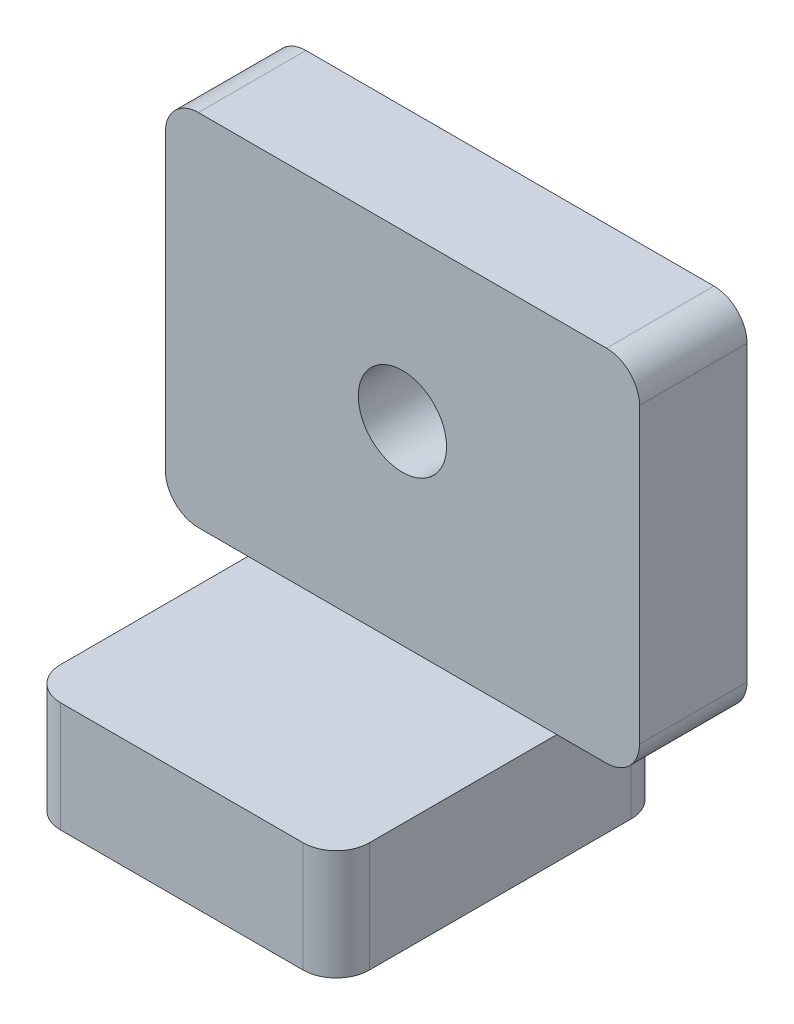
ISO-10303-21;
HEADER;
FILE_DESCRIPTION(('STEP AP214'),'2;1');
FILE_NAME('part.step','',(''),(''),'','','');
FILE_SCHEMA(('AUTOMOTIVE_DESIGN { 1 0 10303 214 1 1 1 1 }'));
ENDSEC;
DATA;
#1=APPLICATION_CONTEXT('core data for automotive mechanical design processes');
#2=APPLICATION_PROTOCOL_DEFINITION('international standard','automotive_design',2000,#1);
#3=PRODUCT_CONTEXT('',#1,'mechanical');
#4=PRODUCT('Part','Part','',(#3));
#5=PRODUCT_RELATED_PRODUCT_CATEGORY('part','',(#4));
#6=PRODUCT_DEFINITION_FORMATION('','',#4);
#7=PRODUCT_DEFINITION_CONTEXT('part definition',#1,'design');
#8=PRODUCT_DEFINITION('design','',#6,#7);
#9=PRODUCT_DEFINITION_SHAPE('','',#8);
#10=(LENGTH_UNIT() NAMED_UNIT(*) SI_UNIT(.MILLI.,.METRE.));
#11=(NAMED_UNIT(*) PLANE_ANGLE_UNIT() SI_UNIT($,.RADIAN.));
#12=(NAMED_UNIT(*) SI_UNIT($,.STERADIAN.) SOLID_ANGLE_UNIT());
#13=UNCERTAINTY_MEASURE_WITH_UNIT(LENGTH_MEASURE(1.E-05),#10,'distance_accuracy_value','');
#14=(GEOMETRIC_REPRESENTATION_CONTEXT(3) GLOBAL_UNCERTAINTY_ASSIGNED_CONTEXT((#13)) GLOBAL_UNIT_ASSIGNED_CONTEXT((#10,
#11,#12)) REPRESENTATION_CONTEXT('',''));
#15=CARTESIAN_POINT('',(0.,0.,0.));
#16=DIRECTION('',(0.,0.,1.));
#17=DIRECTION('',(1.,0.,0.));
#18=AXIS2_PLACEMENT_3D('',#15,#16,#17);
#19=CARTESIAN_POINT('',(-21.5,-16.3,4.875));
#20=DIRECTION('',(0.,1.,0.));
#21=DIRECTION('',(0.,0.,1.));
#22=AXIS2_PLACEMENT_3D('',#19,#20,#21);
#23=PLANE('',#22);
#24=DIRECTION('',(1.,0.,0.));
#25=VECTOR('',#24,1.);
#26=CARTESIAN_POINT('',(-21.5,-16.3,4.875));
#27=LINE('',#26,#25);
#28=CARTESIAN_POINT('',(-18.5,-16.3,4.875));
#29=VERTEX_POINT('',#28);
#30=CARTESIAN_POINT('',(-14.,-16.3,4.875));
#31=VERTEX_POINT('',#30);
#32=EDGE_CURVE('E156',#29,#31,#27,.T.);
#33=ORIENTED_EDGE('',*,*,#32,.F.);
#34=DIRECTION('',(0.,0.,-1.));
#35=VECTOR('',#34,1.);
#36=CARTESIAN_POINT('',(-18.5,-16.3,4.875));
#37=LINE('',#36,#35);
#38=CARTESIAN_POINT('',(-18.5,-16.3,-4.875));
#39=VERTEX_POINT('',#38);
#40=EDGE_CURVE('E262',#29,#39,#37,.T.);
#41=ORIENTED_EDGE('',*,*,#40,.T.);
#42=DIRECTION('',(1.,0.,0.));
#43=VECTOR('',#42,1.);
#44=CARTESIAN_POINT('',(-21.5,-16.3,-4.875));
#45=LINE('',#44,#43);
#46=CARTESIAN_POINT('',(-11.,-16.3,-4.875));
#47=VERTEX_POINT('',#46);
#48=EDGE_CURVE('E206',#39,#47,#45,.T.);
#49=ORIENTED_EDGE('',*,*,#48,.T.);
#50=CARTESIAN_POINT('',(-11.,-16.3,-1.875));
#51=DIRECTION('',(0.,1.,0.));
#52=DIRECTION('',(0.,0.,1.));
#53=AXIS2_PLACEMENT_3D('',#50,#51,#52);
#54=CIRCLE('',#53,3.);
#55=CARTESIAN_POINT('',(-14.,-16.3,-1.875));
#56=VERTEX_POINT('',#55);
#57=EDGE_CURVE('E45',#47,#56,#54,.T.);
#58=ORIENTED_EDGE('',*,*,#57,.T.);
#59=DIRECTION('',(0.,0.,-1.));
#60=VECTOR('',#59,1.);
#61=CARTESIAN_POINT('',(-14.,-16.3,24.875));
#62=LINE('',#61,#60);
#63=EDGE_CURVE('E167',#31,#56,#62,.T.);
#64=ORIENTED_EDGE('',*,*,#63,.F.);
#65=EDGE_LOOP('',(#33,#41,#49,#58,#64));
#66=FACE_BOUND('',#65,.T.);
#67=ADVANCED_FACE('F37',(#66),#23,.F.);
#68=CARTESIAN_POINT('',(21.5,-16.3,4.875));
#69=DIRECTION('',(-1.,0.,0.));
#70=DIRECTION('',(0.,0.,1.));
#71=AXIS2_PLACEMENT_3D('',#68,#69,#70);
#72=PLANE('',#71);
#73=DIRECTION('',(0.,1.,0.));
#74=VECTOR('',#73,1.);
#75=CARTESIAN_POINT('',(21.5,-16.3,4.875));
#76=LINE('',#75,#74);
#77=CARTESIAN_POINT('',(21.5,-13.3,4.875));
#78=VERTEX_POINT('',#77);
#79=CARTESIAN_POINT('',(21.5,13.3,4.875));
#80=VERTEX_POINT('',#79);
#81=EDGE_CURVE('E208',#78,#80,#76,.T.);
#82=ORIENTED_EDGE('',*,*,#81,.F.);
#83=DIRECTION('',(0.,0.,-1.));
#84=VECTOR('',#83,1.);
#85=CARTESIAN_POINT('',(21.5,-13.3,4.875));
#86=LINE('',#85,#84);
#87=CARTESIAN_POINT('',(21.5,-13.3,-4.875));
#88=VERTEX_POINT('',#87);
#89=EDGE_CURVE('E250',#78,#88,#86,.T.);
#90=ORIENTED_EDGE('',*,*,#89,.T.);
#91=DIRECTION('',(0.,1.,0.));
#92=VECTOR('',#91,1.);
#93=CARTESIAN_POINT('',(21.5,-16.3,-4.875));
#94=LINE('',#93,#92);
#95=CARTESIAN_POINT('',(21.5,13.3,-4.875));
#96=VERTEX_POINT('',#95);
#97=EDGE_CURVE('E196',#88,#96,#94,.T.);
#98=ORIENTED_EDGE('',*,*,#97,.T.);
#99=DIRECTION('',(0.,0.,-1.));
#100=VECTOR('',#99,1.);
#101=CARTESIAN_POINT('',(21.5,13.3,4.875));
#102=LINE('',#101,#100);
#103=EDGE_CURVE('E248',#96,#80,#102,.F.);
#104=ORIENTED_EDGE('',*,*,#103,.T.);
#105=EDGE_LOOP('',(#82,#90,#98,#104));
#106=FACE_BOUND('',#105,.T.);
#107=ADVANCED_FACE('F320',(#106),#72,.F.);
#108=CARTESIAN_POINT('',(-21.5,16.3,4.875));
#109=DIRECTION('',(0.,-1.,0.));
#110=DIRECTION('',(0.,0.,-1.));
#111=AXIS2_PLACEMENT_3D('',#108,#109,#110);
#112=PLANE('',#111);
#113=DIRECTION('',(-1.,0.,0.));
#114=VECTOR('',#113,1.);
#115=CARTESIAN_POINT('',(-21.5,16.3,-4.875));
#116=LINE('',#115,#114);
#117=CARTESIAN_POINT('',(18.5,16.3,-4.875));
#118=VERTEX_POINT('',#117);
#119=CARTESIAN_POINT('',(-18.5,16.3,-4.875));
#120=VERTEX_POINT('',#119);
#121=EDGE_CURVE('E199',#118,#120,#116,.T.);
#122=ORIENTED_EDGE('',*,*,#121,.T.);
#123=DIRECTION('',(0.,0.,-1.));
#124=VECTOR('',#123,1.);
#125=CARTESIAN_POINT('',(-18.5,16.3,4.875));
#126=LINE('',#125,#124);
#127=CARTESIAN_POINT('',(-18.5,16.3,4.875));
#128=VERTEX_POINT('',#127);
#129=EDGE_CURVE('E271',#120,#128,#126,.F.);
#130=ORIENTED_EDGE('',*,*,#129,.T.);
#131=DIRECTION('',(-1.,0.,0.));
#132=VECTOR('',#131,1.);
#133=CARTESIAN_POINT('',(-21.5,16.3,4.875));
#134=LINE('',#133,#132);
#135=CARTESIAN_POINT('',(18.5,16.3,4.875));
#136=VERTEX_POINT('',#135);
#137=EDGE_CURVE('E277',#136,#128,#134,.T.);
#138=ORIENTED_EDGE('',*,*,#137,.F.);
#139=DIRECTION('',(0.,0.,-1.));
#140=VECTOR('',#139,1.);
#141=CARTESIAN_POINT('',(18.5,16.3,4.875));
#142=LINE('',#141,#140);
#143=EDGE_CURVE('E268',#136,#118,#142,.T.);
#144=ORIENTED_EDGE('',*,*,#143,.T.);
#145=EDGE_LOOP('',(#122,#130,#138,#144));
#146=FACE_BOUND('',#145,.T.);
#147=ADVANCED_FACE('F276',(#146),#112,.F.);
#148=CARTESIAN_POINT('',(-21.5,-16.3,4.875));
#149=DIRECTION('',(1.,0.,0.));
#150=DIRECTION('',(0.,0.,-1.));
#151=AXIS2_PLACEMENT_3D('',#148,#149,#150);
#152=PLANE('',#151);
#153=DIRECTION('',(0.,-1.,0.));
#154=VECTOR('',#153,1.);
#155=CARTESIAN_POINT('',(-21.5,-16.3,-4.875));
#156=LINE('',#155,#154);
#157=CARTESIAN_POINT('',(-21.5,13.3,-4.875));
#158=VERTEX_POINT('',#157);
#159=CARTESIAN_POINT('',(-21.5,-13.3,-4.875));
#160=VERTEX_POINT('',#159);
#161=EDGE_CURVE('E203',#158,#160,#156,.T.);
#162=ORIENTED_EDGE('',*,*,#161,.T.);
#163=DIRECTION('',(0.,0.,-1.));
#164=VECTOR('',#163,1.);
#165=CARTESIAN_POINT('',(-21.5,-13.3,4.875));
#166=LINE('',#165,#164);
#167=CARTESIAN_POINT('',(-21.5,-13.3,4.875));
#168=VERTEX_POINT('',#167);
#169=EDGE_CURVE('E60',#160,#168,#166,.F.);
#170=ORIENTED_EDGE('',*,*,#169,.T.);
#171=DIRECTION('',(0.,-1.,0.));
#172=VECTOR('',#171,1.);
#173=CARTESIAN_POINT('',(-21.5,-16.3,4.875));
#174=LINE('',#173,#172);
#175=CARTESIAN_POINT('',(-21.5,13.3,4.875));
#176=VERTEX_POINT('',#175);
#177=EDGE_CURVE('E192',#176,#168,#174,.T.);
#178=ORIENTED_EDGE('',*,*,#177,.F.);
#179=DIRECTION('',(0.,0.,-1.));
#180=VECTOR('',#179,1.);
#181=CARTESIAN_POINT('',(-21.5,13.3,4.875));
#182=LINE('',#181,#180);
#183=EDGE_CURVE('E264',#176,#158,#182,.T.);
#184=ORIENTED_EDGE('',*,*,#183,.T.);
#185=EDGE_LOOP('',(#162,#170,#178,#184));
#186=FACE_BOUND('',#185,.T.);
#187=ADVANCED_FACE('F287',(#186),#152,.F.);
#188=CARTESIAN_POINT('',(11.,-16.3,-4.875));
#189=VERTEX_POINT('',#188);
#190=CARTESIAN_POINT('',(18.5,-16.3,-4.875));
#191=VERTEX_POINT('',#190);
#192=EDGE_CURVE('E205',#189,#191,#45,.T.);
#193=ORIENTED_EDGE('',*,*,#192,.T.);
#194=DIRECTION('',(0.,0.,-1.));
#195=VECTOR('',#194,1.);
#196=CARTESIAN_POINT('',(18.5,-16.3,4.875));
#197=LINE('',#196,#195);
#198=CARTESIAN_POINT('',(18.5,-16.3,4.875));
#199=VERTEX_POINT('',#198);
#200=EDGE_CURVE('E253',#191,#199,#197,.F.);
#201=ORIENTED_EDGE('',*,*,#200,.T.);
#202=CARTESIAN_POINT('',(14.,-16.3,4.875));
#203=VERTEX_POINT('',#202);
#204=EDGE_CURVE('E169',#203,#199,#27,.T.);
#205=ORIENTED_EDGE('',*,*,#204,.F.);
#206=DIRECTION('',(0.,0.,-1.));
#207=VECTOR('',#206,1.);
#208=CARTESIAN_POINT('',(14.,-16.3,24.875));
#209=LINE('',#208,#207);
#210=CARTESIAN_POINT('',(14.,-16.3,-1.875));
#211=VERTEX_POINT('',#210);
#212=EDGE_CURVE('E186',#203,#211,#209,.T.);
#213=ORIENTED_EDGE('',*,*,#212,.T.);
#214=CARTESIAN_POINT('',(11.,-16.3,-1.875));
#215=DIRECTION('',(0.,1.,0.));
#216=DIRECTION('',(0.,0.,1.));
#217=AXIS2_PLACEMENT_3D('',#214,#215,#216);
#218=CIRCLE('',#217,3.);
#219=EDGE_CURVE('E11',#211,#189,#218,.T.);
#220=ORIENTED_EDGE('',*,*,#219,.T.);
#221=EDGE_LOOP('',(#193,#201,#205,#213,#220));
#222=FACE_BOUND('',#221,.T.);
#223=ADVANCED_FACE('F326',(#222),#23,.F.);
#224=CARTESIAN_POINT('',(0.,0.,4.875));
#225=DIRECTION('',(0.,0.,-1.));
#226=DIRECTION('',(-1.,0.,0.));
#227=AXIS2_PLACEMENT_3D('',#224,#225,#226);
#228=PLANE('',#227);
#229=CARTESIAN_POINT('',(0.,1.30000000000001,4.875));
#230=DIRECTION('',(0.,0.,1.));
#231=DIRECTION('',(1.,0.,0.));
#232=AXIS2_PLACEMENT_3D('',#229,#230,#231);
#233=CIRCLE('',#232,4.);
#234=CARTESIAN_POINT('',(4.,1.30000000000001,4.875));
#235=VERTEX_POINT('',#234);
#236=EDGE_CURVE('E182',#235,#235,#233,.T.);
#237=ORIENTED_EDGE('',*,*,#236,.F.);
#238=EDGE_LOOP('',(#237));
#239=FACE_BOUND('',#238,.T.);
#240=ORIENTED_EDGE('',*,*,#204,.T.);
#241=CARTESIAN_POINT('',(18.5,-13.3,4.875));
#242=DIRECTION('',(0.,0.,-1.));
#243=DIRECTION('',(-1.,0.,0.));
#244=AXIS2_PLACEMENT_3D('',#241,#242,#243);
#245=CIRCLE('',#244,3.);
#246=EDGE_CURVE('E260',#199,#78,#245,.F.);
#247=ORIENTED_EDGE('',*,*,#246,.T.);
#248=ORIENTED_EDGE('',*,*,#81,.T.);
#249=CARTESIAN_POINT('',(18.5,13.3,4.875));
#250=DIRECTION('',(0.,0.,-1.));
#251=DIRECTION('',(-1.,0.,0.));
#252=AXIS2_PLACEMENT_3D('',#249,#250,#251);
#253=CIRCLE('',#252,3.);
#254=EDGE_CURVE('E255',#80,#136,#253,.F.);
#255=ORIENTED_EDGE('',*,*,#254,.T.);
#256=ORIENTED_EDGE('',*,*,#137,.T.);
#257=CARTESIAN_POINT('',(-18.5,13.3,4.875));
#258=DIRECTION('',(0.,0.,-1.));
#259=DIRECTION('',(-1.,0.,0.));
#260=AXIS2_PLACEMENT_3D('',#257,#258,#259);
#261=CIRCLE('',#260,3.);
#262=EDGE_CURVE('E257',#128,#176,#261,.F.);
#263=ORIENTED_EDGE('',*,*,#262,.T.);
#264=ORIENTED_EDGE('',*,*,#177,.T.);
#265=CARTESIAN_POINT('',(-18.5,-13.3,4.875));
#266=DIRECTION('',(0.,0.,-1.));
#267=DIRECTION('',(-1.,0.,0.));
#268=AXIS2_PLACEMENT_3D('',#265,#266,#267);
#269=CIRCLE('',#268,3.);
#270=EDGE_CURVE('E52',#168,#29,#269,.F.);
#271=ORIENTED_EDGE('',*,*,#270,.T.);
#272=ORIENTED_EDGE('',*,*,#32,.T.);
#273=EDGE_CURVE('E161',#31,#203,#27,.T.);
#274=ORIENTED_EDGE('',*,*,#273,.T.);
#275=EDGE_LOOP('',(#240,#247,#248,#255,#256,#263,#264,#271,#272,#274));
#276=FACE_BOUND('',#275,.T.);
#277=ADVANCED_FACE('F159',(#239,#276),#228,.F.);
#278=CARTESIAN_POINT('',(0.,0.,-4.875));
#279=DIRECTION('',(0.,0.,-1.));
#280=DIRECTION('',(-1.,0.,0.));
#281=AXIS2_PLACEMENT_3D('',#278,#279,#280);
#282=PLANE('',#281);
#283=CARTESIAN_POINT('',(0.,1.30000000000001,-4.875));
#284=DIRECTION('',(0.,0.,1.));
#285=DIRECTION('',(1.,0.,0.));
#286=AXIS2_PLACEMENT_3D('',#283,#284,#285);
#287=CIRCLE('',#286,4.);
#288=CARTESIAN_POINT('',(4.,1.30000000000001,-4.875));
#289=VERTEX_POINT('',#288);
#290=EDGE_CURVE('E200',#289,#289,#287,.T.);
#291=ORIENTED_EDGE('',*,*,#290,.T.);
#292=EDGE_LOOP('',(#291));
#293=FACE_BOUND('',#292,.T.);
#294=DIRECTION('',(1.,0.,0.));
#295=VECTOR('',#294,1.);
#296=CARTESIAN_POINT('',(-14.,-26.3,-4.875));
#297=LINE('',#296,#295);
#298=CARTESIAN_POINT('',(-11.,-26.3,-4.875));
#299=VERTEX_POINT('',#298);
#300=CARTESIAN_POINT('',(11.,-26.3,-4.875));
#301=VERTEX_POINT('',#300);
#302=EDGE_CURVE('E296',#299,#301,#297,.T.);
#303=ORIENTED_EDGE('',*,*,#302,.F.);
#304=DIRECTION('',(0.,-1.,0.));
#305=VECTOR('',#304,1.);
#306=CARTESIAN_POINT('',(-11.,-16.3,-4.875));
#307=LINE('',#306,#305);
#308=EDGE_CURVE('E230',#299,#47,#307,.F.);
#309=ORIENTED_EDGE('',*,*,#308,.T.);
#310=ORIENTED_EDGE('',*,*,#48,.F.);
#311=CARTESIAN_POINT('',(-18.5,-13.3,-4.875));
#312=DIRECTION('',(0.,0.,-1.));
#313=DIRECTION('',(-1.,0.,0.));
#314=AXIS2_PLACEMENT_3D('',#311,#312,#313);
#315=CIRCLE('',#314,3.);
#316=EDGE_CURVE('E224',#39,#160,#315,.T.);
#317=ORIENTED_EDGE('',*,*,#316,.T.);
#318=ORIENTED_EDGE('',*,*,#161,.F.);
#319=CARTESIAN_POINT('',(-18.5,13.3,-4.875));
#320=DIRECTION('',(0.,0.,-1.));
#321=DIRECTION('',(-1.,0.,0.));
#322=AXIS2_PLACEMENT_3D('',#319,#320,#321);
#323=CIRCLE('',#322,3.);
#324=EDGE_CURVE('E222',#158,#120,#323,.T.);
#325=ORIENTED_EDGE('',*,*,#324,.T.);
#326=ORIENTED_EDGE('',*,*,#121,.F.);
#327=CARTESIAN_POINT('',(18.5,13.3,-4.875));
#328=DIRECTION('',(0.,0.,-1.));
#329=DIRECTION('',(-1.,0.,0.));
#330=AXIS2_PLACEMENT_3D('',#327,#328,#329);
#331=CIRCLE('',#330,3.);
#332=EDGE_CURVE('E220',#118,#96,#331,.T.);
#333=ORIENTED_EDGE('',*,*,#332,.T.);
#334=ORIENTED_EDGE('',*,*,#97,.F.);
#335=CARTESIAN_POINT('',(18.5,-13.3,-4.875));
#336=DIRECTION('',(0.,0.,-1.));
#337=DIRECTION('',(-1.,0.,0.));
#338=AXIS2_PLACEMENT_3D('',#335,#336,#337);
#339=CIRCLE('',#338,3.);
#340=EDGE_CURVE('E226',#88,#191,#339,.T.);
#341=ORIENTED_EDGE('',*,*,#340,.T.);
#342=ORIENTED_EDGE('',*,*,#192,.F.);
#343=DIRECTION('',(0.,1.,0.));
#344=VECTOR('',#343,1.);
#345=CARTESIAN_POINT('',(11.,-26.3,-4.875));
#346=LINE('',#345,#344);
#347=EDGE_CURVE('E228',#189,#301,#346,.F.);
#348=ORIENTED_EDGE('',*,*,#347,.T.);
#349=EDGE_LOOP('',(#303,#309,#310,#317,#318,#325,#326,#333,#334,#341,#342,#348));
#350=FACE_BOUND('',#349,.T.);
#351=ADVANCED_FACE('F290',(#293,#350),#282,.T.);
#352=CARTESIAN_POINT('',(0.,1.30000000000001,-4.875));
#353=DIRECTION('',(0.,0.,1.));
#354=DIRECTION('',(1.,0.,0.));
#355=AXIS2_PLACEMENT_3D('',#352,#353,#354);
#356=CYLINDRICAL_SURFACE('',#355,4.);
#357=ORIENTED_EDGE('',*,*,#290,.F.);
#358=EDGE_LOOP('',(#357));
#359=FACE_BOUND('',#358,.T.);
#360=ORIENTED_EDGE('',*,*,#236,.T.);
#361=EDGE_LOOP('',(#360));
#362=FACE_BOUND('',#361,.T.);
#363=ADVANCED_FACE('F448',(#359,#362),#356,.F.);
#364=CARTESIAN_POINT('',(14.,-16.3,24.875));
#365=DIRECTION('',(0.,-1.,0.));
#366=DIRECTION('',(1.,0.,0.));
#367=AXIS2_PLACEMENT_3D('',#364,#365,#366);
#368=PLANE('',#367);
#369=DIRECTION('',(-1.,0.,0.));
#370=VECTOR('',#369,1.);
#371=CARTESIAN_POINT('',(14.,-16.3,24.875));
#372=LINE('',#371,#370);
#373=CARTESIAN_POINT('',(11.,-16.3,24.875));
#374=VERTEX_POINT('',#373);
#375=CARTESIAN_POINT('',(-11.,-16.3,24.875));
#376=VERTEX_POINT('',#375);
#377=EDGE_CURVE('E334',#374,#376,#372,.T.);
#378=ORIENTED_EDGE('',*,*,#377,.F.);
#379=CARTESIAN_POINT('',(11.,-16.3,21.875));
#380=DIRECTION('',(0.,-1.,0.));
#381=DIRECTION('',(1.,0.,0.));
#382=AXIS2_PLACEMENT_3D('',#379,#380,#381);
#383=CIRCLE('',#382,3.);
#384=CARTESIAN_POINT('',(14.,-16.3,21.875));
#385=VERTEX_POINT('',#384);
#386=EDGE_CURVE('E246',#374,#385,#383,.F.);
#387=ORIENTED_EDGE('',*,*,#386,.T.);
#388=EDGE_CURVE('E190',#385,#203,#209,.T.);
#389=ORIENTED_EDGE('',*,*,#388,.T.);
#390=ORIENTED_EDGE('',*,*,#273,.F.);
#391=CARTESIAN_POINT('',(-14.,-16.3,21.875));
#392=VERTEX_POINT('',#391);
#393=EDGE_CURVE('E173',#392,#31,#62,.T.);
#394=ORIENTED_EDGE('',*,*,#393,.F.);
#395=CARTESIAN_POINT('',(-11.,-16.3,21.875));
#396=DIRECTION('',(0.,-1.,0.));
#397=DIRECTION('',(1.,0.,0.));
#398=AXIS2_PLACEMENT_3D('',#395,#396,#397);
#399=CIRCLE('',#398,3.);
#400=EDGE_CURVE('E244',#392,#376,#399,.F.);
#401=ORIENTED_EDGE('',*,*,#400,.T.);
#402=EDGE_LOOP('',(#378,#387,#389,#390,#394,#401));
#403=FACE_BOUND('',#402,.T.);
#404=ADVANCED_FACE('F188',(#403),#368,.F.);
#405=CARTESIAN_POINT('',(-14.,-16.3,24.875));
#406=DIRECTION('',(1.,0.,0.));
#407=DIRECTION('',(0.,0.,-1.));
#408=AXIS2_PLACEMENT_3D('',#405,#406,#407);
#409=PLANE('',#408);
#410=ORIENTED_EDGE('',*,*,#63,.T.);
#411=DIRECTION('',(0.,-1.,0.));
#412=VECTOR('',#411,1.);
#413=CARTESIAN_POINT('',(-14.,-26.3,-1.875));
#414=LINE('',#413,#412);
#415=CARTESIAN_POINT('',(-14.,-26.3,-1.875));
#416=VERTEX_POINT('',#415);
#417=EDGE_CURVE('E210',#56,#416,#414,.T.);
#418=ORIENTED_EDGE('',*,*,#417,.T.);
#419=DIRECTION('',(0.,0.,-1.));
#420=VECTOR('',#419,1.);
#421=CARTESIAN_POINT('',(-14.,-26.3,24.875));
#422=LINE('',#421,#420);
#423=CARTESIAN_POINT('',(-14.,-26.3,21.875));
#424=VERTEX_POINT('',#423);
#425=EDGE_CURVE('E183',#424,#416,#422,.T.);
#426=ORIENTED_EDGE('',*,*,#425,.F.);
#427=DIRECTION('',(0.,-1.,0.));
#428=VECTOR('',#427,1.);
#429=CARTESIAN_POINT('',(-14.,-16.3,21.875));
#430=LINE('',#429,#428);
#431=EDGE_CURVE('E179',#424,#392,#430,.F.);
#432=ORIENTED_EDGE('',*,*,#431,.T.);
#433=ORIENTED_EDGE('',*,*,#393,.T.);
#434=EDGE_LOOP('',(#410,#418,#426,#432,#433));
#435=FACE_BOUND('',#434,.T.);
#436=ADVANCED_FACE('F174',(#435),#409,.F.);
#437=CARTESIAN_POINT('',(-14.,-26.3,24.875));
#438=DIRECTION('',(0.,1.,0.));
#439=DIRECTION('',(-1.,0.,0.));
#440=AXIS2_PLACEMENT_3D('',#437,#438,#439);
#441=PLANE('',#440);
#442=ORIENTED_EDGE('',*,*,#425,.T.);
#443=CARTESIAN_POINT('',(-11.,-26.3,-1.875));
#444=DIRECTION('',(0.,1.,0.));
#445=DIRECTION('',(-1.,0.,0.));
#446=AXIS2_PLACEMENT_3D('',#443,#444,#445);
#447=CIRCLE('',#446,3.);
#448=EDGE_CURVE('E218',#416,#299,#447,.F.);
#449=ORIENTED_EDGE('',*,*,#448,.T.);
#450=ORIENTED_EDGE('',*,*,#302,.T.);
#451=CARTESIAN_POINT('',(11.,-26.3,-1.875));
#452=DIRECTION('',(0.,1.,0.));
#453=DIRECTION('',(-1.,0.,0.));
#454=AXIS2_PLACEMENT_3D('',#451,#452,#453);
#455=CIRCLE('',#454,3.);
#456=CARTESIAN_POINT('',(14.,-26.3,-1.875));
#457=VERTEX_POINT('',#456);
#458=EDGE_CURVE('E216',#301,#457,#455,.F.);
#459=ORIENTED_EDGE('',*,*,#458,.T.);
#460=DIRECTION('',(0.,0.,-1.));
#461=VECTOR('',#460,1.);
#462=CARTESIAN_POINT('',(14.,-26.3,24.875));
#463=LINE('',#462,#461);
#464=CARTESIAN_POINT('',(14.,-26.3,21.875));
#465=VERTEX_POINT('',#464);
#466=EDGE_CURVE('E303',#465,#457,#463,.T.);
#467=ORIENTED_EDGE('',*,*,#466,.F.);
#468=CARTESIAN_POINT('',(11.,-26.3,21.875));
#469=DIRECTION('',(0.,1.,0.));
#470=DIRECTION('',(-1.,0.,0.));
#471=AXIS2_PLACEMENT_3D('',#468,#469,#470);
#472=CIRCLE('',#471,3.);
#473=CARTESIAN_POINT('',(11.,-26.3,24.875));
#474=VERTEX_POINT('',#473);
#475=EDGE_CURVE('E214',#465,#474,#472,.F.);
#476=ORIENTED_EDGE('',*,*,#475,.T.);
#477=DIRECTION('',(1.,0.,0.));
#478=VECTOR('',#477,1.);
#479=CARTESIAN_POINT('',(-14.,-26.3,24.875));
#480=LINE('',#479,#478);
#481=CARTESIAN_POINT('',(-11.,-26.3,24.875));
#482=VERTEX_POINT('',#481);
#483=EDGE_CURVE('E337',#482,#474,#480,.T.);
#484=ORIENTED_EDGE('',*,*,#483,.F.);
#485=CARTESIAN_POINT('',(-11.,-26.3,21.875));
#486=DIRECTION('',(0.,1.,0.));
#487=DIRECTION('',(-1.,0.,0.));
#488=AXIS2_PLACEMENT_3D('',#485,#486,#487);
#489=CIRCLE('',#488,3.);
#490=EDGE_CURVE('E212',#482,#424,#489,.F.);
#491=ORIENTED_EDGE('',*,*,#490,.T.);
#492=EDGE_LOOP('',(#442,#449,#450,#459,#467,#476,#484,#491));
#493=FACE_BOUND('',#492,.T.);
#494=ADVANCED_FACE('F301',(#493),#441,.F.);
#495=CARTESIAN_POINT('',(14.,-26.3,24.875));
#496=DIRECTION('',(-1.,0.,0.));
#497=DIRECTION('',(0.,0.,1.));
#498=AXIS2_PLACEMENT_3D('',#495,#496,#497);
#499=PLANE('',#498);
#500=ORIENTED_EDGE('',*,*,#466,.T.);
#501=DIRECTION('',(0.,1.,0.));
#502=VECTOR('',#501,1.);
#503=CARTESIAN_POINT('',(14.,-16.3,-1.875));
#504=LINE('',#503,#502);
#505=EDGE_CURVE('E235',#457,#211,#504,.T.);
#506=ORIENTED_EDGE('',*,*,#505,.T.);
#507=ORIENTED_EDGE('',*,*,#212,.F.);
#508=ORIENTED_EDGE('',*,*,#388,.F.);
#509=DIRECTION('',(0.,1.,0.));
#510=VECTOR('',#509,1.);
#511=CARTESIAN_POINT('',(14.,-26.3,21.875));
#512=LINE('',#511,#510);
#513=EDGE_CURVE('E233',#385,#465,#512,.F.);
#514=ORIENTED_EDGE('',*,*,#513,.T.);
#515=EDGE_LOOP('',(#500,#506,#507,#508,#514));
#516=FACE_BOUND('',#515,.T.);
#517=ADVANCED_FACE('F350',(#516),#499,.F.);
#518=CARTESIAN_POINT('',(0.,0.,24.875));
#519=DIRECTION('',(0.,0.,1.));
#520=DIRECTION('',(1.,0.,0.));
#521=AXIS2_PLACEMENT_3D('',#518,#519,#520);
#522=PLANE('',#521);
#523=ORIENTED_EDGE('',*,*,#483,.T.);
#524=DIRECTION('',(0.,1.,0.));
#525=VECTOR('',#524,1.);
#526=CARTESIAN_POINT('',(11.,-16.3,24.875));
#527=LINE('',#526,#525);
#528=EDGE_CURVE('E241',#474,#374,#527,.T.);
#529=ORIENTED_EDGE('',*,*,#528,.T.);
#530=ORIENTED_EDGE('',*,*,#377,.T.);
#531=DIRECTION('',(0.,-1.,0.));
#532=VECTOR('',#531,1.);
#533=CARTESIAN_POINT('',(-11.,-26.3,24.875));
#534=LINE('',#533,#532);
#535=EDGE_CURVE('E238',#376,#482,#534,.T.);
#536=ORIENTED_EDGE('',*,*,#535,.T.);
#537=EDGE_LOOP('',(#523,#529,#530,#536));
#538=FACE_BOUND('',#537,.T.);
#539=ADVANCED_FACE('F343',(#538),#522,.T.);
#540=CARTESIAN_POINT('',(-11.,-16.3,-1.875));
#541=DIRECTION('',(0.,1.,0.));
#542=DIRECTION('',(0.,0.,1.));
#543=AXIS2_PLACEMENT_3D('',#540,#541,#542);
#544=CYLINDRICAL_SURFACE('',#543,3.);
#545=ORIENTED_EDGE('',*,*,#57,.F.);
#546=ORIENTED_EDGE('',*,*,#308,.F.);
#547=ORIENTED_EDGE('',*,*,#448,.F.);
#548=ORIENTED_EDGE('',*,*,#417,.F.);
#549=EDGE_LOOP('',(#545,#546,#547,#548));
#550=FACE_BOUND('',#549,.T.);
#551=ADVANCED_FACE('F298',(#550),#544,.T.);
#552=CARTESIAN_POINT('',(11.,-26.3,-1.875));
#553=DIRECTION('',(0.,-1.,0.));
#554=DIRECTION('',(0.,0.,-1.));
#555=AXIS2_PLACEMENT_3D('',#552,#553,#554);
#556=CYLINDRICAL_SURFACE('',#555,3.);
#557=ORIENTED_EDGE('',*,*,#458,.F.);
#558=ORIENTED_EDGE('',*,*,#347,.F.);
#559=ORIENTED_EDGE('',*,*,#219,.F.);
#560=ORIENTED_EDGE('',*,*,#505,.F.);
#561=EDGE_LOOP('',(#557,#558,#559,#560));
#562=FACE_BOUND('',#561,.T.);
#563=ADVANCED_FACE('F332',(#562),#556,.T.);
#564=CARTESIAN_POINT('',(11.,0.,21.875));
#565=DIRECTION('',(0.,-1.,0.));
#566=DIRECTION('',(0.,0.,-1.));
#567=AXIS2_PLACEMENT_3D('',#564,#565,#566);
#568=CYLINDRICAL_SURFACE('',#567,3.);
#569=ORIENTED_EDGE('',*,*,#475,.F.);
#570=ORIENTED_EDGE('',*,*,#513,.F.);
#571=ORIENTED_EDGE('',*,*,#386,.F.);
#572=ORIENTED_EDGE('',*,*,#528,.F.);
#573=EDGE_LOOP('',(#569,#570,#571,#572));
#574=FACE_BOUND('',#573,.T.);
#575=ADVANCED_FACE('F347',(#574),#568,.T.);
#576=CARTESIAN_POINT('',(-11.,0.,21.875));
#577=DIRECTION('',(0.,1.,0.));
#578=DIRECTION('',(0.,0.,1.));
#579=AXIS2_PLACEMENT_3D('',#576,#577,#578);
#580=CYLINDRICAL_SURFACE('',#579,3.);
#581=ORIENTED_EDGE('',*,*,#400,.F.);
#582=ORIENTED_EDGE('',*,*,#431,.F.);
#583=ORIENTED_EDGE('',*,*,#490,.F.);
#584=ORIENTED_EDGE('',*,*,#535,.F.);
#585=EDGE_LOOP('',(#581,#582,#583,#584));
#586=FACE_BOUND('',#585,.T.);
#587=ADVANCED_FACE('F386',(#586),#580,.T.);
#588=CARTESIAN_POINT('',(18.5,-13.3,4.875));
#589=DIRECTION('',(0.,0.,-1.));
#590=DIRECTION('',(-1.,0.,0.));
#591=AXIS2_PLACEMENT_3D('',#588,#589,#590);
#592=CYLINDRICAL_SURFACE('',#591,3.);
#593=ORIENTED_EDGE('',*,*,#246,.F.);
#594=ORIENTED_EDGE('',*,*,#200,.F.);
#595=ORIENTED_EDGE('',*,*,#340,.F.);
#596=ORIENTED_EDGE('',*,*,#89,.F.);
#597=EDGE_LOOP('',(#593,#594,#595,#596));
#598=FACE_BOUND('',#597,.T.);
#599=ADVANCED_FACE('F322',(#598),#592,.T.);
#600=CARTESIAN_POINT('',(-18.5,-13.3,4.875));
#601=DIRECTION('',(0.,0.,-1.));
#602=DIRECTION('',(-1.,0.,0.));
#603=AXIS2_PLACEMENT_3D('',#600,#601,#602);
#604=CYLINDRICAL_SURFACE('',#603,3.);
#605=ORIENTED_EDGE('',*,*,#270,.F.);
#606=ORIENTED_EDGE('',*,*,#169,.F.);
#607=ORIENTED_EDGE('',*,*,#316,.F.);
#608=ORIENTED_EDGE('',*,*,#40,.F.);
#609=EDGE_LOOP('',(#605,#606,#607,#608));
#610=FACE_BOUND('',#609,.T.);
#611=ADVANCED_FACE('F293',(#610),#604,.T.);
#612=CARTESIAN_POINT('',(-18.5,13.3,4.875));
#613=DIRECTION('',(0.,0.,-1.));
#614=DIRECTION('',(-1.,0.,0.));
#615=AXIS2_PLACEMENT_3D('',#612,#613,#614);
#616=CYLINDRICAL_SURFACE('',#615,3.);
#617=ORIENTED_EDGE('',*,*,#262,.F.);
#618=ORIENTED_EDGE('',*,*,#129,.F.);
#619=ORIENTED_EDGE('',*,*,#324,.F.);
#620=ORIENTED_EDGE('',*,*,#183,.F.);
#621=EDGE_LOOP('',(#617,#618,#619,#620));
#622=FACE_BOUND('',#621,.T.);
#623=ADVANCED_FACE('F285',(#622),#616,.T.);
#624=CARTESIAN_POINT('',(18.5,13.3,4.875));
#625=DIRECTION('',(0.,0.,-1.));
#626=DIRECTION('',(-1.,0.,0.));
#627=AXIS2_PLACEMENT_3D('',#624,#625,#626);
#628=CYLINDRICAL_SURFACE('',#627,3.);
#629=ORIENTED_EDGE('',*,*,#254,.F.);
#630=ORIENTED_EDGE('',*,*,#103,.F.);
#631=ORIENTED_EDGE('',*,*,#332,.F.);
#632=ORIENTED_EDGE('',*,*,#143,.F.);
#633=EDGE_LOOP('',(#629,#630,#631,#632));
#634=FACE_BOUND('',#633,.T.);
#635=ADVANCED_FACE('F39',(#634),#628,.T.);
#636=CLOSED_SHELL('',(#67,#107,#147,#187,#223,#277,#351,#363,#404,#436,#494,#517,#539,#551,#563,
#575,#587,#599,#611,#623,#635));
#637=MANIFOLD_SOLID_BREP('B2',#636);
#638=ADVANCED_BREP_SHAPE_REPRESENTATION('',(#18,#637),#14);
#639=SHAPE_DEFINITION_REPRESENTATION(#9,#638);
ENDSEC;
END-ISO-10303-21;
